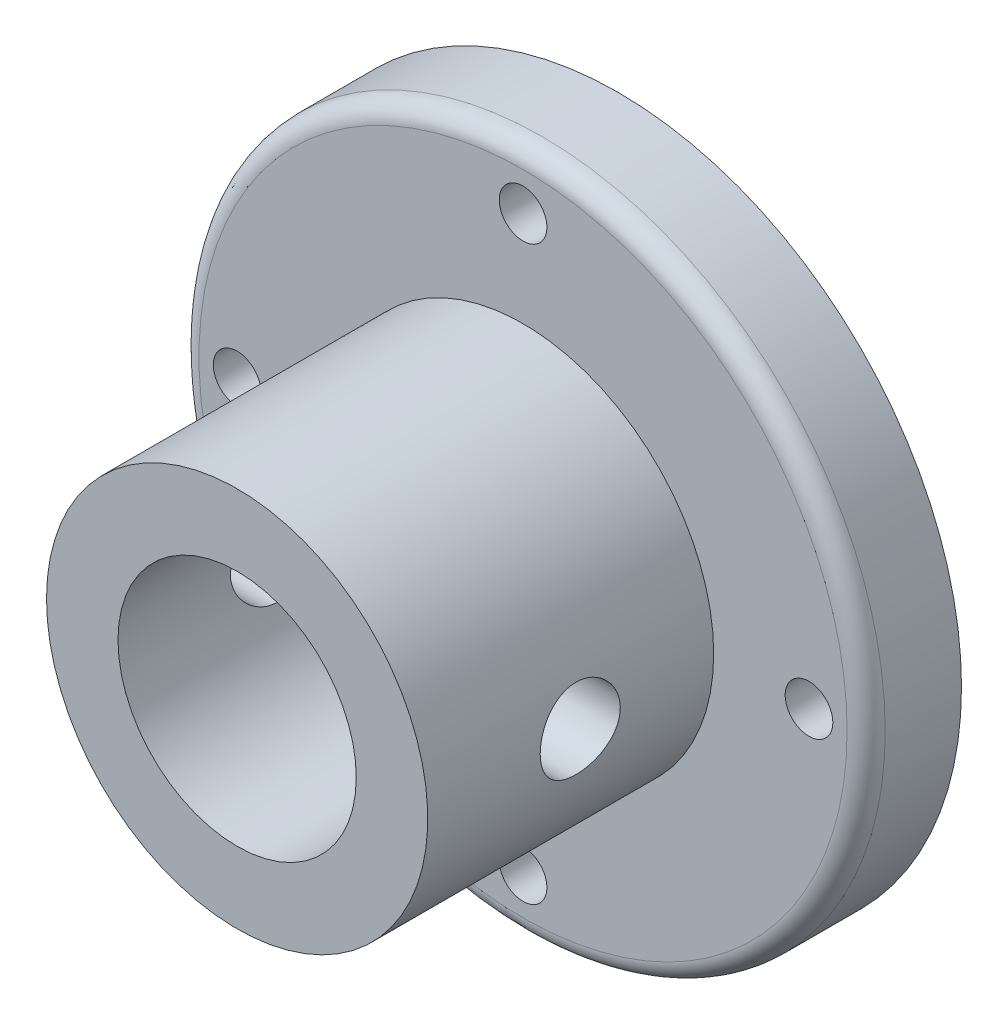
ISO-10303-21;
HEADER;
FILE_DESCRIPTION(('STEP AP214'),'2;1');
FILE_NAME('part.step','',(''),(''),'','','');
FILE_SCHEMA(('AUTOMOTIVE_DESIGN { 1 0 10303 214 1 1 1 1 }'));
ENDSEC;
DATA;
#1=APPLICATION_CONTEXT('core data for automotive mechanical design processes');
#2=APPLICATION_PROTOCOL_DEFINITION('international standard','automotive_design',2000,#1);
#3=PRODUCT_CONTEXT('',#1,'mechanical');
#4=PRODUCT('Part','Part','',(#3));
#5=PRODUCT_RELATED_PRODUCT_CATEGORY('part','',(#4));
#6=PRODUCT_DEFINITION_FORMATION('','',#4);
#7=PRODUCT_DEFINITION_CONTEXT('part definition',#1,'design');
#8=PRODUCT_DEFINITION('design','',#6,#7);
#9=PRODUCT_DEFINITION_SHAPE('','',#8);
#10=(LENGTH_UNIT() NAMED_UNIT(*) SI_UNIT(.MILLI.,.METRE.));
#11=(NAMED_UNIT(*) PLANE_ANGLE_UNIT() SI_UNIT($,.RADIAN.));
#12=(NAMED_UNIT(*) SI_UNIT($,.STERADIAN.) SOLID_ANGLE_UNIT());
#13=UNCERTAINTY_MEASURE_WITH_UNIT(LENGTH_MEASURE(1.E-05),#10,'distance_accuracy_value','');
#14=(GEOMETRIC_REPRESENTATION_CONTEXT(3) GLOBAL_UNCERTAINTY_ASSIGNED_CONTEXT((#13)) GLOBAL_UNIT_ASSIGNED_CONTEXT((#10,
#11,#12)) REPRESENTATION_CONTEXT('',''));
#15=CARTESIAN_POINT('',(0.,0.,0.));
#16=DIRECTION('',(0.,0.,1.));
#17=DIRECTION('',(1.,0.,0.));
#18=AXIS2_PLACEMENT_3D('',#15,#16,#17);
#19=CARTESIAN_POINT('',(0.,0.,20.));
#20=DIRECTION('',(0.,0.,-1.));
#21=DIRECTION('',(-1.,0.,0.));
#22=AXIS2_PLACEMENT_3D('',#19,#20,#21);
#23=CYLINDRICAL_SURFACE('',#22,10.);
#24=CARTESIAN_POINT('',(10.,0.,14.1));
#25=CARTESIAN_POINT('',(9.99999784174829,0.116585848473364,14.099995865841));
#26=CARTESIAN_POINT('',(9.99794034339691,0.233222731019535,14.0902584506974));
#27=CARTESIAN_POINT('',(9.98993117226366,0.46319116851508,14.0516019652962));
#28=CARTESIAN_POINT('',(9.98397656864315,0.576520168694236,14.0226684582911));
#29=CARTESIAN_POINT('',(9.96883710145641,0.7965153908638,13.9465598508173));
#30=CARTESIAN_POINT('',(9.95965548014842,0.903188174300454,13.8994030549874));
#31=CARTESIAN_POINT('',(9.9390563428758,1.10710229811343,13.7882428358507));
#32=CARTESIAN_POINT('',(9.92763892038227,1.20434403251516,13.7242401167751));
#33=CARTESIAN_POINT('',(9.90363206394596,1.38808590292315,13.5801977160653));
#34=CARTESIAN_POINT('',(9.89102905054439,1.47442580055515,13.4999558771351));
#35=CARTESIAN_POINT('',(9.86616860223029,1.63252462040571,13.326147284808));
#36=CARTESIAN_POINT('',(9.85391119633145,1.70428232157116,13.2325794166593));
#37=CARTESIAN_POINT('',(9.83099654351961,1.83187491500254,13.0336053409718));
#38=CARTESIAN_POINT('',(9.82035673245351,1.88754144254535,12.9280889826116));
#39=CARTESIAN_POINT('',(9.80207591218082,1.98029220501562,12.7089396902216));
#40=CARTESIAN_POINT('',(9.79443457437355,2.01737847626435,12.5953076471985));
#41=CARTESIAN_POINT('',(9.78315376674522,2.07139085994391,12.3648841391484));
#42=CARTESIAN_POINT('',(9.77945827760604,2.08859947197018,12.2481616933012));
#43=CARTESIAN_POINT('',(9.77631916855545,2.10324600794067,12.0134324068963));
#44=CARTESIAN_POINT('',(9.77687506815116,2.10068616611949,11.8954257129899));
#45=CARTESIAN_POINT('',(9.78212512350338,2.07609630443195,11.6635618773284));
#46=CARTESIAN_POINT('',(9.78674996617946,2.05439238176156,11.5496683464939));
#47=CARTESIAN_POINT('',(9.79950743260987,1.99264618150703,11.3271758906463));
#48=CARTESIAN_POINT('',(9.80764023928106,1.95260294764374,11.2185772420545));
#49=CARTESIAN_POINT('',(9.82656679318979,1.85500970996108,11.0088295735992));
#50=CARTESIAN_POINT('',(9.83737976611215,1.79733248144916,10.9077415568358));
#51=CARTESIAN_POINT('',(9.86043625269258,1.66619810057573,10.7165573028114));
#52=CARTESIAN_POINT('',(9.87267994674737,1.59273895732349,10.6264624545906));
#53=CARTESIAN_POINT('',(9.89751709685519,1.43039035861383,10.4579425173351));
#54=CARTESIAN_POINT('',(9.91011266656499,1.34122311428427,10.3797851108274));
#55=CARTESIAN_POINT('',(9.93401206544501,1.15090722413534,10.2394921297123));
#56=CARTESIAN_POINT('',(9.94531587462659,1.04975839296274,10.1773568030112));
#57=CARTESIAN_POINT('',(9.96539042281928,0.838037867962102,10.0708136012267));
#58=CARTESIAN_POINT('',(9.97415644683678,0.72744912271924,10.0264386657289));
#59=CARTESIAN_POINT('',(9.98813236508417,0.500160504113519,9.95697390147539));
#60=CARTESIAN_POINT('',(9.99334273514646,0.383461450709025,9.93188149219502));
#61=CARTESIAN_POINT('',(9.999553245205,0.149562961257186,9.90207845650715));
#62=CARTESIAN_POINT('',(10.0006289742647,0.0324121045882318,9.89700185814685));
#63=CARTESIAN_POINT('',(9.99865992879095,-0.201063734683158,9.90638562365941));
#64=CARTESIAN_POINT('',(9.99561541081341,-0.317388768253834,9.92084477109798));
#65=CARTESIAN_POINT('',(9.98579546752832,-0.544713549463647,9.96858581565403));
#66=CARTESIAN_POINT('',(9.97905771410959,-0.655754963588223,10.0016777451874));
#67=CARTESIAN_POINT('',(9.96260466983568,-0.870711992740468,10.0855356989538));
#68=CARTESIAN_POINT('',(9.95288913942048,-0.974627033633176,10.1363031452141));
#69=CARTESIAN_POINT('',(9.93137081358651,-1.17390925603868,10.2548474290989));
#70=CARTESIAN_POINT('',(9.91954194116376,-1.26914415319218,10.3228418107208));
#71=CARTESIAN_POINT('',(9.89516597530744,-1.44698364055018,10.4736211114868));
#72=CARTESIAN_POINT('',(9.88261879650457,-1.52958672518771,10.5564077911569));
#73=CARTESIAN_POINT('',(9.85796225014561,-1.68124837965331,10.7360948908823));
#74=CARTESIAN_POINT('',(9.84586386089685,-1.75005453646667,10.8332101319551));
#75=CARTESIAN_POINT('',(9.82371807962839,-1.87038000862553,11.0378338551398));
#76=CARTESIAN_POINT('',(9.81367060162088,-1.92190004877804,11.1453419012377));
#77=CARTESIAN_POINT('',(9.79685512681397,-2.00585765397315,11.3671367106961));
#78=CARTESIAN_POINT('',(9.79006933548588,-2.03839897242379,11.481382784895));
#79=CARTESIAN_POINT('',(9.78051064822007,-2.08378481112456,11.7138807017294));
#80=CARTESIAN_POINT('',(9.77773716773119,-2.09663220058767,11.8321319582828));
#81=CARTESIAN_POINT('',(9.77655189286799,-2.10215088993251,12.0667437890884));
#82=CARTESIAN_POINT('',(9.77805372506118,-2.09522172489448,12.1830947096789));
#83=CARTESIAN_POINT('',(9.7850556392901,-2.06227175489667,12.4129321064204));
#84=CARTESIAN_POINT('',(9.79055568161922,-2.03625113953586,12.5264186110066));
#85=CARTESIAN_POINT('',(9.80489383691469,-1.96604298349062,12.747018412835));
#86=CARTESIAN_POINT('',(9.81372205894963,-1.92190923862789,12.8541495162455));
#87=CARTESIAN_POINT('',(9.83372653328036,-1.81677553393118,13.0595474744154));
#88=CARTESIAN_POINT('',(9.84490300778009,-1.75577397780386,13.157813489055));
#89=CARTESIAN_POINT('',(9.86860568754315,-1.61729229779259,13.3446709811717));
#90=CARTESIAN_POINT('',(9.88115320809288,-1.53952560584191,13.4330474167356));
#91=CARTESIAN_POINT('',(9.90603640741152,-1.37030722670289,13.5956276875319));
#92=CARTESIAN_POINT('',(9.91837203672091,-1.27885239155516,13.6698282536798));
#93=CARTESIAN_POINT('',(9.94161311089209,-1.08355972724414,13.8027804084968));
#94=CARTESIAN_POINT('',(9.9525000394512,-0.97958897353337,13.8613401419301));
#95=CARTESIAN_POINT('',(9.97143310733194,-0.763077961330647,13.9600616936167));
#96=CARTESIAN_POINT('',(9.97948171315422,-0.650545247094994,14.0002394948325));
#97=CARTESIAN_POINT('',(9.99033406290932,-0.448192668149308,14.0535986105871));
#98=CARTESIAN_POINT('',(9.99393693379196,-0.359495832337146,14.0709669828687));
#99=CARTESIAN_POINT('',(9.9987706929081,-0.180542826933378,14.0941690589129));
#100=CARTESIAN_POINT('',(10.0000016713989,-0.0902867168085126,14.1000032015862));
#101=CARTESIAN_POINT('',(10.,0.,14.1));
#102=B_SPLINE_CURVE_WITH_KNOTS('',3,(#24,#25,#26,#27,#28,#29,#30,#31,#32,#33,#34,#35,#36,#37,
#38,#39,#40,#41,#42,#43,#44,#45,#46,#47,#48,#49,#50,#51,#52,#53,#54,#55,#56,#57,#58,#59,#60,#61,
#62,#63,#64,#65,#66,#67,#68,#69,#70,#71,#72,#73,#74,#75,#76,#77,#78,#79,#80,#81,#82,#83,#84,#85,
#86,#87,#88,#89,#90,#91,#92,#93,#94,#95,#96,#97,#98,#99,#100,#101),.UNSPECIFIED.,.T.,.F.,(4,2,2,
2,2,2,2,2,2,2,2,2,2,2,2,2,2,2,2,2,2,2,2,2,2,2,2,2,2,2,2,2,2,2,2,2,2,2,4),(0.,0.349427151413709,
0.699117393804616,1.04845729410207,1.39778259282672,1.75175847869132,2.10576399283703,
2.46334953414211,2.82089587693427,3.17329573378425,3.52565576291483,3.8721272117825,
4.21861672900331,4.56766755159189,4.91676243287246,5.27279917277341,5.6288414212253,
5.98554098256069,6.34219279951006,6.69229244225199,7.04237028630823,7.38894196355635,
7.73554152956649,8.08675749600878,8.43801529078867,8.79520758876064,9.1523849077843,
9.50759083987138,9.86274501700571,10.2107752970461,10.5588021208121,10.9058027033669,
11.2528361357323,11.606352994583,11.9599512794926,12.3177061013305,12.6751492638876,
12.9457638475906,13.2163681334281),.UNSPECIFIED.);
#103=CARTESIAN_POINT('',(10.,0.,14.1));
#104=VERTEX_POINT('',#103);
#105=EDGE_CURVE('E80',#104,#104,#102,.T.);
#106=ORIENTED_EDGE('',*,*,#105,.T.);
#107=EDGE_LOOP('',(#106));
#108=FACE_BOUND('',#107,.T.);
#109=CARTESIAN_POINT('',(0.,0.,5.));
#110=DIRECTION('',(0.,0.,1.));
#111=DIRECTION('',(1.,0.,0.));
#112=AXIS2_PLACEMENT_3D('',#109,#110,#111);
#113=CIRCLE('',#112,10.);
#114=CARTESIAN_POINT('',(10.,0.,5.));
#115=VERTEX_POINT('',#114);
#116=EDGE_CURVE('E179',#115,#115,#113,.T.);
#117=ORIENTED_EDGE('',*,*,#116,.T.);
#118=EDGE_LOOP('',(#117));
#119=FACE_BOUND('',#118,.T.);
#120=CARTESIAN_POINT('',(0.,0.,20.));
#121=DIRECTION('',(0.,0.,-1.));
#122=DIRECTION('',(-1.,0.,0.));
#123=AXIS2_PLACEMENT_3D('',#120,#121,#122);
#124=CIRCLE('',#123,10.);
#125=CARTESIAN_POINT('',(-10.,0.,20.));
#126=VERTEX_POINT('',#125);
#127=EDGE_CURVE('E183',#126,#126,#124,.T.);
#128=ORIENTED_EDGE('',*,*,#127,.T.);
#129=EDGE_LOOP('',(#128));
#130=FACE_BOUND('',#129,.T.);
#131=CARTESIAN_POINT('',(-10.,0.,14.1));
#132=CARTESIAN_POINT('',(-9.99999784174829,-0.116585848473364,14.099995865841));
#133=CARTESIAN_POINT('',(-9.99794034339691,-0.233222731019535,14.0902584506974));
#134=CARTESIAN_POINT('',(-9.98993117226366,-0.46319116851508,14.0516019652962));
#135=CARTESIAN_POINT('',(-9.98397656864315,-0.576520168694236,14.0226684582911));
#136=CARTESIAN_POINT('',(-9.96883710145641,-0.7965153908638,13.9465598508173));
#137=CARTESIAN_POINT('',(-9.95965548014842,-0.903188174300454,13.8994030549874));
#138=CARTESIAN_POINT('',(-9.9390563428758,-1.10710229811343,13.7882428358507));
#139=CARTESIAN_POINT('',(-9.92763892038227,-1.20434403251516,13.7242401167751));
#140=CARTESIAN_POINT('',(-9.90363206394596,-1.38808590292315,13.5801977160653));
#141=CARTESIAN_POINT('',(-9.89102905054439,-1.47442580055515,13.4999558771351));
#142=CARTESIAN_POINT('',(-9.86616860223029,-1.63252462040571,13.326147284808));
#143=CARTESIAN_POINT('',(-9.85391119633145,-1.70428232157116,13.2325794166593));
#144=CARTESIAN_POINT('',(-9.83099654351961,-1.83187491500254,13.0336053409718));
#145=CARTESIAN_POINT('',(-9.82035673245351,-1.88754144254535,12.9280889826116));
#146=CARTESIAN_POINT('',(-9.80207591218082,-1.98029220501562,12.7089396902216));
#147=CARTESIAN_POINT('',(-9.79443457437355,-2.01737847626435,12.5953076471985));
#148=CARTESIAN_POINT('',(-9.78315376674522,-2.07139085994391,12.3648841391484));
#149=CARTESIAN_POINT('',(-9.77945827760604,-2.08859947197018,12.2481616933012));
#150=CARTESIAN_POINT('',(-9.77631916855545,-2.10324600794067,12.0134324068963));
#151=CARTESIAN_POINT('',(-9.77687506815116,-2.10068616611949,11.8954257129899));
#152=CARTESIAN_POINT('',(-9.78212512350338,-2.07609630443195,11.6635618773284));
#153=CARTESIAN_POINT('',(-9.78674996617946,-2.05439238176156,11.5496683464939));
#154=CARTESIAN_POINT('',(-9.79950743260987,-1.99264618150703,11.3271758906463));
#155=CARTESIAN_POINT('',(-9.80764023928106,-1.95260294764374,11.2185772420545));
#156=CARTESIAN_POINT('',(-9.82656679318979,-1.85500970996108,11.0088295735992));
#157=CARTESIAN_POINT('',(-9.83737976611215,-1.79733248144916,10.9077415568358));
#158=CARTESIAN_POINT('',(-9.86043625269258,-1.66619810057573,10.7165573028114));
#159=CARTESIAN_POINT('',(-9.87267994674737,-1.59273895732349,10.6264624545906));
#160=CARTESIAN_POINT('',(-9.89751709685519,-1.43039035861383,10.4579425173351));
#161=CARTESIAN_POINT('',(-9.91011266656499,-1.34122311428427,10.3797851108274));
#162=CARTESIAN_POINT('',(-9.93401206544501,-1.15090722413534,10.2394921297123));
#163=CARTESIAN_POINT('',(-9.94531587462659,-1.04975839296274,10.1773568030112));
#164=CARTESIAN_POINT('',(-9.96539042281928,-0.838037867962102,10.0708136012267));
#165=CARTESIAN_POINT('',(-9.97415644683678,-0.72744912271924,10.0264386657289));
#166=CARTESIAN_POINT('',(-9.98813236508417,-0.500160504113519,9.95697390147539));
#167=CARTESIAN_POINT('',(-9.99334273514646,-0.383461450709025,9.93188149219502));
#168=CARTESIAN_POINT('',(-9.999553245205,-0.149562961257186,9.90207845650715));
#169=CARTESIAN_POINT('',(-10.0006289742647,-0.0324121045882318,9.89700185814685));
#170=CARTESIAN_POINT('',(-9.99865992879095,0.201063734683158,9.90638562365941));
#171=CARTESIAN_POINT('',(-9.99561541081341,0.317388768253834,9.92084477109798));
#172=CARTESIAN_POINT('',(-9.98579546752832,0.544713549463647,9.96858581565403));
#173=CARTESIAN_POINT('',(-9.97905771410959,0.655754963588223,10.0016777451874));
#174=CARTESIAN_POINT('',(-9.96260466983568,0.870711992740468,10.0855356989538));
#175=CARTESIAN_POINT('',(-9.95288913942048,0.974627033633176,10.1363031452141));
#176=CARTESIAN_POINT('',(-9.93137081358651,1.17390925603868,10.2548474290989));
#177=CARTESIAN_POINT('',(-9.91954194116376,1.26914415319218,10.3228418107208));
#178=CARTESIAN_POINT('',(-9.89516597530744,1.44698364055018,10.4736211114868));
#179=CARTESIAN_POINT('',(-9.88261879650457,1.52958672518771,10.5564077911569));
#180=CARTESIAN_POINT('',(-9.85796225014561,1.68124837965331,10.7360948908823));
#181=CARTESIAN_POINT('',(-9.84586386089685,1.75005453646667,10.8332101319551));
#182=CARTESIAN_POINT('',(-9.82371807962839,1.87038000862553,11.0378338551398));
#183=CARTESIAN_POINT('',(-9.81367060162088,1.92190004877804,11.1453419012377));
#184=CARTESIAN_POINT('',(-9.79685512681397,2.00585765397315,11.3671367106961));
#185=CARTESIAN_POINT('',(-9.79006933548588,2.03839897242379,11.481382784895));
#186=CARTESIAN_POINT('',(-9.78051064822007,2.08378481112456,11.7138807017294));
#187=CARTESIAN_POINT('',(-9.77773716773119,2.09663220058767,11.8321319582828));
#188=CARTESIAN_POINT('',(-9.77655189286799,2.10215088993251,12.0667437890884));
#189=CARTESIAN_POINT('',(-9.77805372506118,2.09522172489448,12.1830947096789));
#190=CARTESIAN_POINT('',(-9.7850556392901,2.06227175489667,12.4129321064204));
#191=CARTESIAN_POINT('',(-9.79055568161922,2.03625113953586,12.5264186110066));
#192=CARTESIAN_POINT('',(-9.80489383691469,1.96604298349062,12.747018412835));
#193=CARTESIAN_POINT('',(-9.81372205894963,1.92190923862789,12.8541495162455));
#194=CARTESIAN_POINT('',(-9.83372653328036,1.81677553393118,13.0595474744154));
#195=CARTESIAN_POINT('',(-9.84490300778009,1.75577397780386,13.157813489055));
#196=CARTESIAN_POINT('',(-9.86860568754315,1.61729229779259,13.3446709811717));
#197=CARTESIAN_POINT('',(-9.88115320809288,1.53952560584191,13.4330474167356));
#198=CARTESIAN_POINT('',(-9.90603640741152,1.37030722670289,13.5956276875319));
#199=CARTESIAN_POINT('',(-9.91837203672091,1.27885239155516,13.6698282536798));
#200=CARTESIAN_POINT('',(-9.94161311089209,1.08355972724414,13.8027804084968));
#201=CARTESIAN_POINT('',(-9.9525000394512,0.97958897353337,13.8613401419301));
#202=CARTESIAN_POINT('',(-9.97143310733194,0.763077961330647,13.9600616936167));
#203=CARTESIAN_POINT('',(-9.97948171315422,0.650545247094994,14.0002394948325));
#204=CARTESIAN_POINT('',(-9.99033406290932,0.448192668149308,14.0535986105871));
#205=CARTESIAN_POINT('',(-9.99393693379196,0.359495832337146,14.0709669828687));
#206=CARTESIAN_POINT('',(-9.9987706929081,0.180542826933378,14.0941690589129));
#207=CARTESIAN_POINT('',(-10.0000016713989,0.0902867168085126,14.1000032015862));
#208=CARTESIAN_POINT('',(-10.,0.,14.1));
#209=B_SPLINE_CURVE_WITH_KNOTS('',3,(#131,#132,#133,#134,#135,#136,#137,#138,#139,#140,#141,
#142,#143,#144,#145,#146,#147,#148,#149,#150,#151,#152,#153,#154,#155,#156,#157,#158,#159,#160,
#161,#162,#163,#164,#165,#166,#167,#168,#169,#170,#171,#172,#173,#174,#175,#176,#177,#178,#179,
#180,#181,#182,#183,#184,#185,#186,#187,#188,#189,#190,#191,#192,#193,#194,#195,#196,#197,#198,
#199,#200,#201,#202,#203,#204,#205,#206,#207,#208),.UNSPECIFIED.,.T.,.F.,(4,2,2,2,2,2,2,2,2,2,2,
2,2,2,2,2,2,2,2,2,2,2,2,2,2,2,2,2,2,2,2,2,2,2,2,2,2,2,4),(0.,0.349427151413709,
0.699117393804616,1.04845729410207,1.39778259282672,1.75175847869132,2.10576399283703,
2.46334953414211,2.82089587693427,3.17329573378425,3.52565576291483,3.8721272117825,
4.21861672900331,4.56766755159189,4.91676243287246,5.27279917277341,5.6288414212253,
5.98554098256069,6.34219279951006,6.69229244225199,7.04237028630823,7.38894196355635,
7.73554152956649,8.08675749600878,8.43801529078867,8.79520758876064,9.1523849077843,
9.50759083987138,9.86274501700571,10.2107752970461,10.5588021208121,10.9058027033669,
11.2528361357323,11.606352994583,11.9599512794926,12.3177061013305,12.6751492638876,
12.9457638475906,13.2163681334281),.UNSPECIFIED.);
#210=CARTESIAN_POINT('',(-10.,0.,14.1));
#211=VERTEX_POINT('',#210);
#212=EDGE_CURVE('E87',#211,#211,#209,.T.);
#213=ORIENTED_EDGE('',*,*,#212,.T.);
#214=EDGE_LOOP('',(#213));
#215=FACE_BOUND('',#214,.T.);
#216=ADVANCED_FACE('F37',(#108,#119,#130,#215),#23,.T.);
#217=CARTESIAN_POINT('',(0.,0.,20.));
#218=DIRECTION('',(0.,0.,-1.));
#219=DIRECTION('',(-1.,0.,0.));
#220=AXIS2_PLACEMENT_3D('',#217,#218,#219);
#221=CYLINDRICAL_SURFACE('',#220,6.25);
#222=CARTESIAN_POINT('',(0.,0.,20.));
#223=DIRECTION('',(0.,0.,-1.));
#224=DIRECTION('',(-1.,0.,0.));
#225=AXIS2_PLACEMENT_3D('',#222,#223,#224);
#226=CIRCLE('',#225,6.25);
#227=CARTESIAN_POINT('',(-6.25,0.,20.));
#228=VERTEX_POINT('',#227);
#229=EDGE_CURVE('E187',#228,#228,#226,.T.);
#230=ORIENTED_EDGE('',*,*,#229,.F.);
#231=EDGE_LOOP('',(#230));
#232=FACE_BOUND('',#231,.T.);
#233=CARTESIAN_POINT('',(0.,0.,3.));
#234=DIRECTION('',(0.,0.,-1.));
#235=DIRECTION('',(-1.,0.,0.));
#236=AXIS2_PLACEMENT_3D('',#233,#234,#235);
#237=CIRCLE('',#236,6.25);
#238=CARTESIAN_POINT('',(-6.25,0.,3.));
#239=VERTEX_POINT('',#238);
#240=EDGE_CURVE('E188',#239,#239,#237,.T.);
#241=ORIENTED_EDGE('',*,*,#240,.T.);
#242=EDGE_LOOP('',(#241));
#243=FACE_BOUND('',#242,.T.);
#244=CARTESIAN_POINT('',(6.25,0.,14.1));
#245=CARTESIAN_POINT('',(6.2500004558075,0.114530955609412,14.1000007177231));
#246=CARTESIAN_POINT('',(6.24682290659146,0.229057218710794,14.0906000556309));
#247=CARTESIAN_POINT('',(6.23446030225972,0.45473329221245,14.0533630882387));
#248=CARTESIAN_POINT('',(6.225274718703,0.565882804708197,14.0255251612732));
#249=CARTESIAN_POINT('',(6.20189340419603,0.781519301634756,13.9524778029722));
#250=CARTESIAN_POINT('',(6.18770613229277,0.886017185456679,13.9072976900236));
#251=CARTESIAN_POINT('',(6.15576737339854,1.0859518358883,13.8009819895304));
#252=CARTESIAN_POINT('',(6.1380151659299,1.18138676511244,13.7398431759635));
#253=CARTESIAN_POINT('',(6.1001153336638,1.36383833475925,13.6010911172172));
#254=CARTESIAN_POINT('',(6.07990966466718,1.45049280025856,13.5230175811942));
#255=CARTESIAN_POINT('',(6.03969741831387,1.60975623541905,13.3535908109103));
#256=CARTESIAN_POINT('',(6.01969088670539,1.68236204521407,13.2622345971434));
#257=CARTESIAN_POINT('',(5.98150128203386,1.81354859077598,13.0655583765216));
#258=CARTESIAN_POINT('',(5.96338881097672,1.8716560650079,12.9599076610428));
#259=CARTESIAN_POINT('',(5.93192189006317,1.96912293600883,12.739626590572));
#260=CARTESIAN_POINT('',(5.91856596187185,2.00848815915859,12.6249990391184));
#261=CARTESIAN_POINT('',(5.89873609682992,2.06599002993103,12.3941401588043));
#262=CARTESIAN_POINT('',(5.8920425787449,2.08480615093623,12.2780974970551));
#263=CARTESIAN_POINT('',(5.88564631114991,2.10279989635807,12.0443239639408));
#264=CARTESIAN_POINT('',(5.88594136011403,2.10198370530935,11.9265936359007));
#265=CARTESIAN_POINT('',(5.89329664874675,2.08126306659923,11.6986060264463));
#266=CARTESIAN_POINT('',(5.90004146719269,2.06224855726179,11.5882559141768));
#267=CARTESIAN_POINT('',(5.91901970448595,2.00712400485165,11.3724140363478));
#268=CARTESIAN_POINT('',(5.93125379036323,1.97101188412821,11.2669228629419));
#269=CARTESIAN_POINT('',(5.96005465447743,1.88214054333184,11.0617842954552));
#270=CARTESIAN_POINT('',(5.97668877630681,1.82911968349739,10.9622601149304));
#271=CARTESIAN_POINT('',(6.01238760500369,1.70811758858156,10.7732415994639));
#272=CARTESIAN_POINT('',(6.03145302225249,1.64013197683342,10.6837502103438));
#273=CARTESIAN_POINT('',(6.07110389067045,1.48686843332686,10.5123411927054));
#274=CARTESIAN_POINT('',(6.09171629778916,1.40086395611352,10.4310780891132));
#275=CARTESIAN_POINT('',(6.13125395031087,1.21619513990659,10.283955900704));
#276=CARTESIAN_POINT('',(6.1501790285433,1.11752954888165,10.21809834113));
#277=CARTESIAN_POINT('',(6.18446510548902,0.9089340997345,10.1031183799402));
#278=CARTESIAN_POINT('',(6.1997876972965,0.79889941381625,10.0541739146977));
#279=CARTESIAN_POINT('',(6.22486323314157,0.571519966340487,9.97569375361037));
#280=CARTESIAN_POINT('',(6.23461814419549,0.454177802725407,9.94615120267058));
#281=CARTESIAN_POINT('',(6.24713213337384,0.221053382865995,9.9084789996332));
#282=CARTESIAN_POINT('',(6.25017990470396,0.105429325474286,9.89946510371503));
#283=CARTESIAN_POINT('',(6.24980365310205,-0.125703868914322,9.900583831732));
#284=CARTESIAN_POINT('',(6.24638074246945,-0.241213022248089,9.91071316497793));
#285=CARTESIAN_POINT('',(6.2336383276688,-0.46528138896449,9.9491326346003));
#286=CARTESIAN_POINT('',(6.22449588125436,-0.573945106546486,9.97687781403929));
#287=CARTESIAN_POINT('',(6.20141202227678,-0.78502979276706,10.0490578653532));
#288=CARTESIAN_POINT('',(6.18746999594161,-0.887449961005551,10.0934948718513));
#289=CARTESIAN_POINT('',(6.15573987550567,-1.08617043238829,10.199102892511));
#290=CARTESIAN_POINT('',(6.13785954553245,-1.18223624090407,10.2606866419186));
#291=CARTESIAN_POINT('',(6.10027731329995,-1.36295652858878,10.3983563438469));
#292=CARTESIAN_POINT('',(6.08057484782161,-1.44760745943006,10.4744467881291));
#293=CARTESIAN_POINT('',(6.04041386733723,-1.60716701833656,10.6431271438483));
#294=CARTESIAN_POINT('',(6.01996248291463,-1.68144476505625,10.7363169765782));
#295=CARTESIAN_POINT('',(5.98154320436435,-1.81338874157473,10.9342756393695));
#296=CARTESIAN_POINT('',(5.96357534040067,-1.87105476962236,11.0390446100395));
#297=CARTESIAN_POINT('',(5.93232870100668,-1.96788609866207,11.2572731792034));
#298=CARTESIAN_POINT('',(5.91904181768146,-2.00708342930482,11.3707173323859));
#299=CARTESIAN_POINT('',(5.89886637136143,-2.06563630297539,11.6031472012109));
#300=CARTESIAN_POINT('',(5.89197486457282,-2.08500097540772,11.7221303407435));
#301=CARTESIAN_POINT('',(5.88570878915689,-2.1026198878554,11.9555805931896));
#302=CARTESIAN_POINT('',(5.88596075252427,-2.10192293951818,12.0699593930231));
#303=CARTESIAN_POINT('',(5.89302776050126,-2.08202610538273,12.2968789772461));
#304=CARTESIAN_POINT('',(5.89984240242135,-2.06282735486508,12.4094198739795));
#305=CARTESIAN_POINT('',(5.91898670116492,-2.00721927317076,12.627269613307));
#306=CARTESIAN_POINT('',(5.93120557193447,-1.97115487419038,12.7326770064551));
#307=CARTESIAN_POINT('',(5.95973910033586,-1.88311999976253,12.9360246442461));
#308=CARTESIAN_POINT('',(5.97605467607408,-1.83114595825618,13.0339632086381));
#309=CARTESIAN_POINT('',(6.01184245569504,-1.71008670844567,13.2242872194034));
#310=CARTESIAN_POINT('',(6.03142232750852,-1.64034658108763,13.3162357176967));
#311=CARTESIAN_POINT('',(6.07108683356588,-1.48683617681711,13.4874632679267));
#312=CARTESIAN_POINT('',(6.09117161020162,-1.40306190343525,13.5667386983823));
#313=CARTESIAN_POINT('',(6.13054357939716,-1.21985441589777,13.7135555785832));
#314=CARTESIAN_POINT('',(6.14976711506906,-1.11993031047046,13.7805037029875));
#315=CARTESIAN_POINT('',(6.18437102346184,-0.909610620994345,13.8965825907735));
#316=CARTESIAN_POINT('',(6.19975230585834,-0.799217524094918,13.945717572765));
#317=CARTESIAN_POINT('',(6.22441865906529,-0.5755539748575,14.0229126734618));
#318=CARTESIAN_POINT('',(6.2339199639635,-0.462568072090491,14.051726587075));
#319=CARTESIAN_POINT('',(6.24670950992188,-0.233052475093974,14.0902671429275));
#320=CARTESIAN_POINT('',(6.24999953626139,-0.116523808932368,14.0999992697884));
#321=CARTESIAN_POINT('',(6.25,0.,14.1));
#322=B_SPLINE_CURVE_WITH_KNOTS('',3,(#244,#245,#246,#247,#248,#249,#250,#251,#252,#253,#254,
#255,#256,#257,#258,#259,#260,#261,#262,#263,#264,#265,#266,#267,#268,#269,#270,#271,#272,#273,
#274,#275,#276,#277,#278,#279,#280,#281,#282,#283,#284,#285,#286,#287,#288,#289,#290,#291,#292,
#293,#294,#295,#296,#297,#298,#299,#300,#301,#302,#303,#304,#305,#306,#307,#308,#309,#310,#311,
#312,#313,#314,#315,#316,#317,#318,#319,#320,#321),.UNSPECIFIED.,.T.,.F.,(4,2,2,2,2,2,2,2,2,2,2,
2,2,2,2,2,2,2,2,2,2,2,2,2,2,2,2,2,2,2,2,2,2,2,2,2,2,2,4),(0.,0.343164003216163,
0.686358193730809,1.02897472368762,1.37166056665955,1.72519565773436,2.07881017479189,
2.44278551023186,2.8066476231051,3.15807548110517,3.5093926344014,3.84436309850656,
4.17937427767465,4.51984368488998,4.86041280012182,5.2190666822336,5.5777560582563,
5.94011172259143,6.30233929025034,6.64864288694435,6.99488696004138,7.33090948320379,
7.666974993021,8.01195769082523,8.35704738089266,8.71808227019165,9.0791215441144,
9.43953235371286,9.79977718369725,10.1412245423915,10.4826509510252,10.8173810414541,
11.1521862147986,11.5017936300905,11.8515007719925,12.2151405478213,12.5786941480644,
12.9279296434174,13.2770647443206),.UNSPECIFIED.);
#323=CARTESIAN_POINT('',(6.25,0.,14.1));
#324=VERTEX_POINT('',#323);
#325=EDGE_CURVE('E61',#324,#324,#322,.T.);
#326=ORIENTED_EDGE('',*,*,#325,.F.);
#327=EDGE_LOOP('',(#326));
#328=FACE_BOUND('',#327,.T.);
#329=CARTESIAN_POINT('',(-6.25,0.,14.1));
#330=CARTESIAN_POINT('',(-6.2500004558075,-0.114530955609412,14.1000007177231));
#331=CARTESIAN_POINT('',(-6.24682290659146,-0.229057218710794,14.0906000556309));
#332=CARTESIAN_POINT('',(-6.23446030225972,-0.45473329221245,14.0533630882387));
#333=CARTESIAN_POINT('',(-6.225274718703,-0.565882804708197,14.0255251612732));
#334=CARTESIAN_POINT('',(-6.20189340419603,-0.781519301634756,13.9524778029722));
#335=CARTESIAN_POINT('',(-6.18770613229277,-0.886017185456679,13.9072976900236));
#336=CARTESIAN_POINT('',(-6.15576737339854,-1.0859518358883,13.8009819895304));
#337=CARTESIAN_POINT('',(-6.1380151659299,-1.18138676511244,13.7398431759635));
#338=CARTESIAN_POINT('',(-6.1001153336638,-1.36383833475925,13.6010911172172));
#339=CARTESIAN_POINT('',(-6.07990966466718,-1.45049280025856,13.5230175811942));
#340=CARTESIAN_POINT('',(-6.03969741831387,-1.60975623541905,13.3535908109103));
#341=CARTESIAN_POINT('',(-6.01969088670539,-1.68236204521407,13.2622345971434));
#342=CARTESIAN_POINT('',(-5.98150128203386,-1.81354859077598,13.0655583765216));
#343=CARTESIAN_POINT('',(-5.96338881097672,-1.8716560650079,12.9599076610428));
#344=CARTESIAN_POINT('',(-5.93192189006317,-1.96912293600883,12.739626590572));
#345=CARTESIAN_POINT('',(-5.91856596187185,-2.00848815915859,12.6249990391184));
#346=CARTESIAN_POINT('',(-5.89873609682992,-2.06599002993103,12.3941401588043));
#347=CARTESIAN_POINT('',(-5.8920425787449,-2.08480615093623,12.2780974970551));
#348=CARTESIAN_POINT('',(-5.88564631114991,-2.10279989635807,12.0443239639408));
#349=CARTESIAN_POINT('',(-5.88594136011403,-2.10198370530935,11.9265936359007));
#350=CARTESIAN_POINT('',(-5.89329664874675,-2.08126306659923,11.6986060264463));
#351=CARTESIAN_POINT('',(-5.90004146719269,-2.06224855726179,11.5882559141768));
#352=CARTESIAN_POINT('',(-5.91901970448595,-2.00712400485165,11.3724140363478));
#353=CARTESIAN_POINT('',(-5.93125379036323,-1.97101188412821,11.2669228629419));
#354=CARTESIAN_POINT('',(-5.96005465447743,-1.88214054333184,11.0617842954552));
#355=CARTESIAN_POINT('',(-5.97668877630681,-1.82911968349739,10.9622601149304));
#356=CARTESIAN_POINT('',(-6.01238760500369,-1.70811758858156,10.7732415994639));
#357=CARTESIAN_POINT('',(-6.03145302225249,-1.64013197683342,10.6837502103438));
#358=CARTESIAN_POINT('',(-6.07110389067045,-1.48686843332686,10.5123411927054));
#359=CARTESIAN_POINT('',(-6.09171629778916,-1.40086395611352,10.4310780891132));
#360=CARTESIAN_POINT('',(-6.13125395031087,-1.21619513990659,10.283955900704));
#361=CARTESIAN_POINT('',(-6.1501790285433,-1.11752954888165,10.21809834113));
#362=CARTESIAN_POINT('',(-6.18446510548902,-0.9089340997345,10.1031183799402));
#363=CARTESIAN_POINT('',(-6.1997876972965,-0.79889941381625,10.0541739146977));
#364=CARTESIAN_POINT('',(-6.22486323314157,-0.571519966340487,9.97569375361037));
#365=CARTESIAN_POINT('',(-6.23461814419549,-0.454177802725407,9.94615120267058));
#366=CARTESIAN_POINT('',(-6.24713213337384,-0.221053382865995,9.9084789996332));
#367=CARTESIAN_POINT('',(-6.25017990470396,-0.105429325474286,9.89946510371503));
#368=CARTESIAN_POINT('',(-6.24980365310205,0.125703868914322,9.900583831732));
#369=CARTESIAN_POINT('',(-6.24638074246945,0.241213022248089,9.91071316497793));
#370=CARTESIAN_POINT('',(-6.2336383276688,0.46528138896449,9.9491326346003));
#371=CARTESIAN_POINT('',(-6.22449588125436,0.573945106546486,9.97687781403929));
#372=CARTESIAN_POINT('',(-6.20141202227678,0.78502979276706,10.0490578653532));
#373=CARTESIAN_POINT('',(-6.18746999594161,0.887449961005551,10.0934948718513));
#374=CARTESIAN_POINT('',(-6.15573987550567,1.08617043238829,10.199102892511));
#375=CARTESIAN_POINT('',(-6.13785954553245,1.18223624090407,10.2606866419186));
#376=CARTESIAN_POINT('',(-6.10027731329995,1.36295652858878,10.3983563438469));
#377=CARTESIAN_POINT('',(-6.08057484782161,1.44760745943006,10.4744467881291));
#378=CARTESIAN_POINT('',(-6.04041386733723,1.60716701833656,10.6431271438483));
#379=CARTESIAN_POINT('',(-6.01996248291463,1.68144476505625,10.7363169765782));
#380=CARTESIAN_POINT('',(-5.98154320436435,1.81338874157473,10.9342756393695));
#381=CARTESIAN_POINT('',(-5.96357534040067,1.87105476962236,11.0390446100395));
#382=CARTESIAN_POINT('',(-5.93232870100668,1.96788609866207,11.2572731792034));
#383=CARTESIAN_POINT('',(-5.91904181768146,2.00708342930482,11.3707173323859));
#384=CARTESIAN_POINT('',(-5.89886637136143,2.06563630297539,11.6031472012109));
#385=CARTESIAN_POINT('',(-5.89197486457282,2.08500097540772,11.7221303407435));
#386=CARTESIAN_POINT('',(-5.88570878915689,2.1026198878554,11.9555805931896));
#387=CARTESIAN_POINT('',(-5.88596075252427,2.10192293951818,12.0699593930231));
#388=CARTESIAN_POINT('',(-5.89302776050126,2.08202610538273,12.2968789772461));
#389=CARTESIAN_POINT('',(-5.89984240242135,2.06282735486508,12.4094198739795));
#390=CARTESIAN_POINT('',(-5.91898670116492,2.00721927317076,12.627269613307));
#391=CARTESIAN_POINT('',(-5.93120557193447,1.97115487419038,12.7326770064551));
#392=CARTESIAN_POINT('',(-5.95973910033586,1.88311999976253,12.9360246442461));
#393=CARTESIAN_POINT('',(-5.97605467607408,1.83114595825618,13.0339632086381));
#394=CARTESIAN_POINT('',(-6.01184245569504,1.71008670844567,13.2242872194034));
#395=CARTESIAN_POINT('',(-6.03142232750852,1.64034658108763,13.3162357176967));
#396=CARTESIAN_POINT('',(-6.07108683356588,1.48683617681711,13.4874632679267));
#397=CARTESIAN_POINT('',(-6.09117161020162,1.40306190343525,13.5667386983823));
#398=CARTESIAN_POINT('',(-6.13054357939716,1.21985441589777,13.7135555785832));
#399=CARTESIAN_POINT('',(-6.14976711506906,1.11993031047046,13.7805037029875));
#400=CARTESIAN_POINT('',(-6.18437102346184,0.909610620994345,13.8965825907735));
#401=CARTESIAN_POINT('',(-6.19975230585834,0.799217524094918,13.945717572765));
#402=CARTESIAN_POINT('',(-6.22441865906529,0.5755539748575,14.0229126734618));
#403=CARTESIAN_POINT('',(-6.2339199639635,0.462568072090491,14.051726587075));
#404=CARTESIAN_POINT('',(-6.24670950992188,0.233052475093974,14.0902671429275));
#405=CARTESIAN_POINT('',(-6.24999953626139,0.116523808932368,14.0999992697884));
#406=CARTESIAN_POINT('',(-6.25,0.,14.1));
#407=B_SPLINE_CURVE_WITH_KNOTS('',3,(#329,#330,#331,#332,#333,#334,#335,#336,#337,#338,#339,
#340,#341,#342,#343,#344,#345,#346,#347,#348,#349,#350,#351,#352,#353,#354,#355,#356,#357,#358,
#359,#360,#361,#362,#363,#364,#365,#366,#367,#368,#369,#370,#371,#372,#373,#374,#375,#376,#377,
#378,#379,#380,#381,#382,#383,#384,#385,#386,#387,#388,#389,#390,#391,#392,#393,#394,#395,#396,
#397,#398,#399,#400,#401,#402,#403,#404,#405,#406),.UNSPECIFIED.,.T.,.F.,(4,2,2,2,2,2,2,2,2,2,2,
2,2,2,2,2,2,2,2,2,2,2,2,2,2,2,2,2,2,2,2,2,2,2,2,2,2,2,4),(0.,0.343164003216163,
0.686358193730809,1.02897472368762,1.37166056665955,1.72519565773436,2.07881017479189,
2.44278551023186,2.8066476231051,3.15807548110517,3.5093926344014,3.84436309850656,
4.17937427767465,4.51984368488998,4.86041280012182,5.2190666822336,5.5777560582563,
5.94011172259143,6.30233929025034,6.64864288694435,6.99488696004138,7.33090948320379,
7.666974993021,8.01195769082523,8.35704738089266,8.71808227019165,9.0791215441144,
9.43953235371286,9.79977718369725,10.1412245423915,10.4826509510252,10.8173810414541,
11.1521862147986,11.5017936300905,11.8515007719925,12.2151405478213,12.5786941480644,
12.9279296434174,13.2770647443206),.UNSPECIFIED.);
#408=CARTESIAN_POINT('',(-6.25,0.,14.1));
#409=VERTEX_POINT('',#408);
#410=EDGE_CURVE('E41',#409,#409,#407,.T.);
#411=ORIENTED_EDGE('',*,*,#410,.F.);
#412=EDGE_LOOP('',(#411));
#413=FACE_BOUND('',#412,.T.);
#414=ADVANCED_FACE('F67',(#232,#243,#328,#413),#221,.F.);
#415=CARTESIAN_POINT('',(0.,0.,5.));
#416=DIRECTION('',(0.,0.,-1.));
#417=DIRECTION('',(-1.,0.,0.));
#418=AXIS2_PLACEMENT_3D('',#415,#416,#417);
#419=CYLINDRICAL_SURFACE('',#418,12.);
#420=CARTESIAN_POINT('',(0.,0.,0.));
#421=DIRECTION('',(0.,0.,1.));
#422=DIRECTION('',(1.,0.,0.));
#423=AXIS2_PLACEMENT_3D('',#420,#421,#422);
#424=CIRCLE('',#423,12.);
#425=CARTESIAN_POINT('',(12.,0.,0.));
#426=VERTEX_POINT('',#425);
#427=EDGE_CURVE('E137',#426,#426,#424,.T.);
#428=ORIENTED_EDGE('',*,*,#427,.F.);
#429=EDGE_LOOP('',(#428));
#430=FACE_BOUND('',#429,.T.);
#431=CARTESIAN_POINT('',(0.,0.,3.));
#432=DIRECTION('',(0.,0.,1.));
#433=DIRECTION('',(1.,0.,0.));
#434=AXIS2_PLACEMENT_3D('',#431,#432,#433);
#435=CIRCLE('',#434,12.);
#436=CARTESIAN_POINT('',(12.,0.,3.));
#437=VERTEX_POINT('',#436);
#438=EDGE_CURVE('E172',#437,#437,#435,.T.);
#439=ORIENTED_EDGE('',*,*,#438,.T.);
#440=EDGE_LOOP('',(#439));
#441=FACE_BOUND('',#440,.T.);
#442=ADVANCED_FACE('F119',(#430,#441),#419,.F.);
#443=CARTESIAN_POINT('',(0.,0.,5.));
#444=DIRECTION('',(0.,0.,1.));
#445=DIRECTION('',(1.,0.,0.));
#446=AXIS2_PLACEMENT_3D('',#443,#444,#445);
#447=PLANE('',#446);
#448=CARTESIAN_POINT('',(0.,0.,5.));
#449=DIRECTION('',(0.,0.,1.));
#450=DIRECTION('',(1.,0.,0.));
#451=AXIS2_PLACEMENT_3D('',#448,#449,#450);
#452=CIRCLE('',#451,17.);
#453=CARTESIAN_POINT('',(17.,0.,5.));
#454=VERTEX_POINT('',#453);
#455=EDGE_CURVE('E51',#454,#454,#452,.T.);
#456=ORIENTED_EDGE('',*,*,#455,.T.);
#457=EDGE_LOOP('',(#456));
#458=FACE_BOUND('',#457,.T.);
#459=CARTESIAN_POINT('',(0.,-15.,5.));
#460=DIRECTION('',(0.,0.,1.));
#461=DIRECTION('',(1.,0.,0.));
#462=AXIS2_PLACEMENT_3D('',#459,#460,#461);
#463=CIRCLE('',#462,1.25);
#464=CARTESIAN_POINT('',(1.25,-15.,5.));
#465=VERTEX_POINT('',#464);
#466=EDGE_CURVE('E156',#465,#465,#463,.T.);
#467=ORIENTED_EDGE('',*,*,#466,.F.);
#468=EDGE_LOOP('',(#467));
#469=FACE_BOUND('',#468,.T.);
#470=CARTESIAN_POINT('',(0.,15.,5.));
#471=DIRECTION('',(0.,0.,1.));
#472=DIRECTION('',(1.,0.,0.));
#473=AXIS2_PLACEMENT_3D('',#470,#471,#472);
#474=CIRCLE('',#473,1.25);
#475=CARTESIAN_POINT('',(1.25,15.,5.));
#476=VERTEX_POINT('',#475);
#477=EDGE_CURVE('E141',#476,#476,#474,.T.);
#478=ORIENTED_EDGE('',*,*,#477,.F.);
#479=EDGE_LOOP('',(#478));
#480=FACE_BOUND('',#479,.T.);
#481=CARTESIAN_POINT('',(-15.,0.,5.));
#482=DIRECTION('',(0.,0.,1.));
#483=DIRECTION('',(1.,0.,0.));
#484=AXIS2_PLACEMENT_3D('',#481,#482,#483);
#485=CIRCLE('',#484,1.25);
#486=CARTESIAN_POINT('',(-13.75,0.,5.));
#487=VERTEX_POINT('',#486);
#488=EDGE_CURVE('E148',#487,#487,#485,.T.);
#489=ORIENTED_EDGE('',*,*,#488,.F.);
#490=EDGE_LOOP('',(#489));
#491=FACE_BOUND('',#490,.T.);
#492=CARTESIAN_POINT('',(15.,0.,5.));
#493=DIRECTION('',(0.,0.,1.));
#494=DIRECTION('',(1.,0.,0.));
#495=AXIS2_PLACEMENT_3D('',#492,#493,#494);
#496=CIRCLE('',#495,1.25);
#497=CARTESIAN_POINT('',(16.25,0.,5.));
#498=VERTEX_POINT('',#497);
#499=EDGE_CURVE('E164',#498,#498,#496,.T.);
#500=ORIENTED_EDGE('',*,*,#499,.F.);
#501=EDGE_LOOP('',(#500));
#502=FACE_BOUND('',#501,.T.);
#503=ORIENTED_EDGE('',*,*,#116,.F.);
#504=EDGE_LOOP('',(#503));
#505=FACE_BOUND('',#504,.T.);
#506=ADVANCED_FACE('F122',(#458,#469,#480,#491,#502,#505),#447,.T.);
#507=CARTESIAN_POINT('',(0.,0.,0.));
#508=DIRECTION('',(0.,0.,1.));
#509=DIRECTION('',(1.,0.,0.));
#510=AXIS2_PLACEMENT_3D('',#507,#508,#509);
#511=PLANE('',#510);
#512=CARTESIAN_POINT('',(0.,0.,0.));
#513=DIRECTION('',(0.,0.,1.));
#514=DIRECTION('',(1.,0.,0.));
#515=AXIS2_PLACEMENT_3D('',#512,#513,#514);
#516=CIRCLE('',#515,18.);
#517=CARTESIAN_POINT('',(18.,0.,0.));
#518=VERTEX_POINT('',#517);
#519=EDGE_CURVE('E58',#518,#518,#516,.T.);
#520=ORIENTED_EDGE('',*,*,#519,.F.);
#521=EDGE_LOOP('',(#520));
#522=FACE_BOUND('',#521,.T.);
#523=ORIENTED_EDGE('',*,*,#427,.T.);
#524=EDGE_LOOP('',(#523));
#525=FACE_BOUND('',#524,.T.);
#526=CARTESIAN_POINT('',(0.,15.,0.));
#527=DIRECTION('',(0.,0.,1.));
#528=DIRECTION('',(1.,0.,0.));
#529=AXIS2_PLACEMENT_3D('',#526,#527,#528);
#530=CIRCLE('',#529,1.25);
#531=CARTESIAN_POINT('',(1.25,15.,0.));
#532=VERTEX_POINT('',#531);
#533=EDGE_CURVE('E144',#532,#532,#530,.T.);
#534=ORIENTED_EDGE('',*,*,#533,.T.);
#535=EDGE_LOOP('',(#534));
#536=FACE_BOUND('',#535,.T.);
#537=CARTESIAN_POINT('',(-15.,0.,0.));
#538=DIRECTION('',(0.,0.,1.));
#539=DIRECTION('',(1.,0.,0.));
#540=AXIS2_PLACEMENT_3D('',#537,#538,#539);
#541=CIRCLE('',#540,1.25);
#542=CARTESIAN_POINT('',(-13.75,0.,0.));
#543=VERTEX_POINT('',#542);
#544=EDGE_CURVE('E152',#543,#543,#541,.T.);
#545=ORIENTED_EDGE('',*,*,#544,.T.);
#546=EDGE_LOOP('',(#545));
#547=FACE_BOUND('',#546,.T.);
#548=CARTESIAN_POINT('',(0.,-15.,0.));
#549=DIRECTION('',(0.,0.,1.));
#550=DIRECTION('',(1.,0.,0.));
#551=AXIS2_PLACEMENT_3D('',#548,#549,#550);
#552=CIRCLE('',#551,1.25);
#553=CARTESIAN_POINT('',(1.25,-15.,0.));
#554=VERTEX_POINT('',#553);
#555=EDGE_CURVE('E160',#554,#554,#552,.T.);
#556=ORIENTED_EDGE('',*,*,#555,.T.);
#557=EDGE_LOOP('',(#556));
#558=FACE_BOUND('',#557,.T.);
#559=CARTESIAN_POINT('',(15.,0.,0.));
#560=DIRECTION('',(0.,0.,1.));
#561=DIRECTION('',(1.,0.,0.));
#562=AXIS2_PLACEMENT_3D('',#559,#560,#561);
#563=CIRCLE('',#562,1.25);
#564=CARTESIAN_POINT('',(16.25,0.,0.));
#565=VERTEX_POINT('',#564);
#566=EDGE_CURVE('E168',#565,#565,#563,.T.);
#567=ORIENTED_EDGE('',*,*,#566,.T.);
#568=EDGE_LOOP('',(#567));
#569=FACE_BOUND('',#568,.T.);
#570=ADVANCED_FACE('F126',(#522,#525,#536,#547,#558,#569),#511,.F.);
#571=CARTESIAN_POINT('',(0.,0.,5.));
#572=DIRECTION('',(0.,0.,-1.));
#573=DIRECTION('',(-1.,0.,0.));
#574=AXIS2_PLACEMENT_3D('',#571,#572,#573);
#575=CYLINDRICAL_SURFACE('',#574,18.);
#576=CARTESIAN_POINT('',(0.,0.,4.));
#577=DIRECTION('',(0.,0.,1.));
#578=DIRECTION('',(1.,0.,0.));
#579=AXIS2_PLACEMENT_3D('',#576,#577,#578);
#580=CIRCLE('',#579,18.);
#581=CARTESIAN_POINT('',(18.,0.,4.));
#582=VERTEX_POINT('',#581);
#583=EDGE_CURVE('E10',#582,#582,#580,.F.);
#584=ORIENTED_EDGE('',*,*,#583,.T.);
#585=EDGE_LOOP('',(#584));
#586=FACE_BOUND('',#585,.T.);
#587=ORIENTED_EDGE('',*,*,#519,.T.);
#588=EDGE_LOOP('',(#587));
#589=FACE_BOUND('',#588,.T.);
#590=ADVANCED_FACE('F117',(#586,#589),#575,.T.);
#591=CARTESIAN_POINT('',(0.,15.,5.));
#592=DIRECTION('',(0.,0.,-1.));
#593=DIRECTION('',(-1.,0.,0.));
#594=AXIS2_PLACEMENT_3D('',#591,#592,#593);
#595=CYLINDRICAL_SURFACE('',#594,1.25);
#596=ORIENTED_EDGE('',*,*,#477,.T.);
#597=EDGE_LOOP('',(#596));
#598=FACE_BOUND('',#597,.T.);
#599=ORIENTED_EDGE('',*,*,#533,.F.);
#600=EDGE_LOOP('',(#599));
#601=FACE_BOUND('',#600,.T.);
#602=ADVANCED_FACE('F113',(#598,#601),#595,.F.);
#603=CARTESIAN_POINT('',(-15.,0.,5.));
#604=DIRECTION('',(0.,0.,-1.));
#605=DIRECTION('',(-1.,0.,0.));
#606=AXIS2_PLACEMENT_3D('',#603,#604,#605);
#607=CYLINDRICAL_SURFACE('',#606,1.25);
#608=ORIENTED_EDGE('',*,*,#488,.T.);
#609=EDGE_LOOP('',(#608));
#610=FACE_BOUND('',#609,.T.);
#611=ORIENTED_EDGE('',*,*,#544,.F.);
#612=EDGE_LOOP('',(#611));
#613=FACE_BOUND('',#612,.T.);
#614=ADVANCED_FACE('F109',(#610,#613),#607,.F.);
#615=CARTESIAN_POINT('',(0.,-15.,5.));
#616=DIRECTION('',(0.,0.,-1.));
#617=DIRECTION('',(-1.,0.,0.));
#618=AXIS2_PLACEMENT_3D('',#615,#616,#617);
#619=CYLINDRICAL_SURFACE('',#618,1.25);
#620=ORIENTED_EDGE('',*,*,#466,.T.);
#621=EDGE_LOOP('',(#620));
#622=FACE_BOUND('',#621,.T.);
#623=ORIENTED_EDGE('',*,*,#555,.F.);
#624=EDGE_LOOP('',(#623));
#625=FACE_BOUND('',#624,.T.);
#626=ADVANCED_FACE('F105',(#622,#625),#619,.F.);
#627=CARTESIAN_POINT('',(15.,0.,5.));
#628=DIRECTION('',(0.,0.,-1.));
#629=DIRECTION('',(-1.,0.,0.));
#630=AXIS2_PLACEMENT_3D('',#627,#628,#629);
#631=CYLINDRICAL_SURFACE('',#630,1.25);
#632=ORIENTED_EDGE('',*,*,#499,.T.);
#633=EDGE_LOOP('',(#632));
#634=FACE_BOUND('',#633,.T.);
#635=ORIENTED_EDGE('',*,*,#566,.F.);
#636=EDGE_LOOP('',(#635));
#637=FACE_BOUND('',#636,.T.);
#638=ADVANCED_FACE('F101',(#634,#637),#631,.F.);
#639=CARTESIAN_POINT('',(0.,0.,3.));
#640=DIRECTION('',(0.,0.,1.));
#641=DIRECTION('',(1.,0.,0.));
#642=AXIS2_PLACEMENT_3D('',#639,#640,#641);
#643=PLANE('',#642);
#644=ORIENTED_EDGE('',*,*,#438,.F.);
#645=EDGE_LOOP('',(#644));
#646=FACE_BOUND('',#645,.T.);
#647=ORIENTED_EDGE('',*,*,#240,.F.);
#648=EDGE_LOOP('',(#647));
#649=FACE_BOUND('',#648,.T.);
#650=ADVANCED_FACE('F97',(#646,#649),#643,.F.);
#651=CARTESIAN_POINT('',(0.,0.,4.));
#652=DIRECTION('',(0.,0.,1.));
#653=DIRECTION('',(1.,0.,0.));
#654=AXIS2_PLACEMENT_3D('',#651,#652,#653);
#655=TOROIDAL_SURFACE('',#654,17.,1.);
#656=ORIENTED_EDGE('',*,*,#583,.F.);
#657=EDGE_LOOP('',(#656));
#658=FACE_BOUND('',#657,.T.);
#659=ORIENTED_EDGE('',*,*,#455,.F.);
#660=EDGE_LOOP('',(#659));
#661=FACE_BOUND('',#660,.T.);
#662=ADVANCED_FACE('F39',(#658,#661),#655,.T.);
#663=CARTESIAN_POINT('',(0.,0.,20.));
#664=DIRECTION('',(0.,0.,-1.));
#665=DIRECTION('',(-1.,0.,0.));
#666=AXIS2_PLACEMENT_3D('',#663,#664,#665);
#667=PLANE('',#666);
#668=ORIENTED_EDGE('',*,*,#229,.T.);
#669=EDGE_LOOP('',(#668));
#670=FACE_BOUND('',#669,.T.);
#671=ORIENTED_EDGE('',*,*,#127,.F.);
#672=EDGE_LOOP('',(#671));
#673=FACE_BOUND('',#672,.T.);
#674=ADVANCED_FACE('F96',(#670,#673),#667,.F.);
#675=CARTESIAN_POINT('',(20.,0.,12.));
#676=DIRECTION('',(-1.,0.,0.));
#677=DIRECTION('',(0.,0.,1.));
#678=AXIS2_PLACEMENT_3D('',#675,#676,#677);
#679=CYLINDRICAL_SURFACE('',#678,2.1);
#680=ORIENTED_EDGE('',*,*,#105,.F.);
#681=EDGE_LOOP('',(#680));
#682=FACE_BOUND('',#681,.T.);
#683=ORIENTED_EDGE('',*,*,#325,.T.);
#684=EDGE_LOOP('',(#683));
#685=FACE_BOUND('',#684,.T.);
#686=ADVANCED_FACE('F73',(#682,#685),#679,.F.);
#687=ORIENTED_EDGE('',*,*,#212,.F.);
#688=EDGE_LOOP('',(#687));
#689=FACE_BOUND('',#688,.T.);
#690=ORIENTED_EDGE('',*,*,#410,.T.);
#691=EDGE_LOOP('',(#690));
#692=FACE_BOUND('',#691,.T.);
#693=ADVANCED_FACE('F70',(#689,#692),#679,.F.);
#694=CLOSED_SHELL('',(#216,#414,#442,#506,#570,#590,#602,#614,#626,#638,#650,#662,#674,#686,#693));
#695=MANIFOLD_SOLID_BREP('B2',#694);
#696=ADVANCED_BREP_SHAPE_REPRESENTATION('',(#18,#695),#14);
#697=SHAPE_DEFINITION_REPRESENTATION(#9,#696);
ENDSEC;
END-ISO-10303-21;
